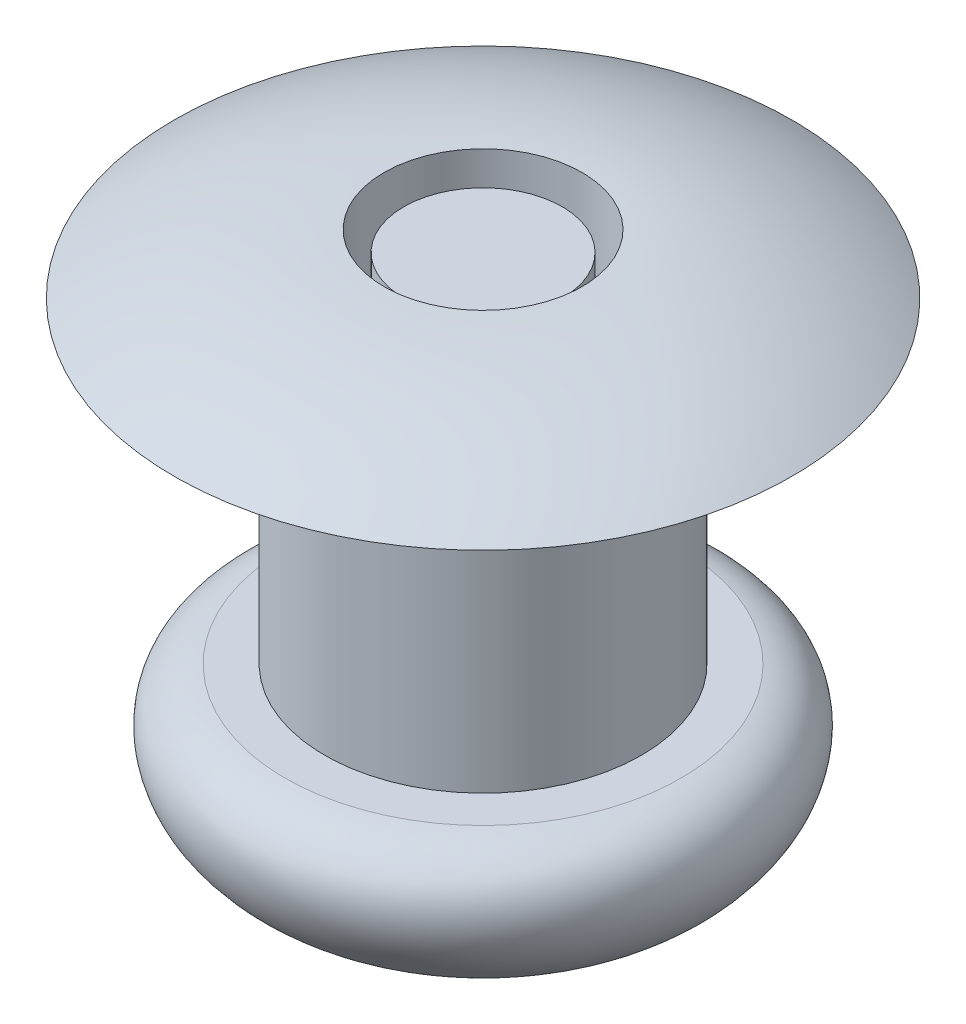
ISO-10303-21;
HEADER;
FILE_DESCRIPTION(('STEP AP214'),'2;1');
FILE_NAME('part.step','',(''),(''),'','','');
FILE_SCHEMA(('AUTOMOTIVE_DESIGN { 1 0 10303 214 1 1 1 1 }'));
ENDSEC;
DATA;
#1=APPLICATION_CONTEXT('core data for automotive mechanical design processes');
#2=APPLICATION_PROTOCOL_DEFINITION('international standard','automotive_design',2000,#1);
#3=PRODUCT_CONTEXT('',#1,'mechanical');
#4=PRODUCT('Part','Part','',(#3));
#5=PRODUCT_RELATED_PRODUCT_CATEGORY('part','',(#4));
#6=PRODUCT_DEFINITION_FORMATION('','',#4);
#7=PRODUCT_DEFINITION_CONTEXT('part definition',#1,'design');
#8=PRODUCT_DEFINITION('design','',#6,#7);
#9=PRODUCT_DEFINITION_SHAPE('','',#8);
#10=(LENGTH_UNIT() NAMED_UNIT(*) SI_UNIT(.MILLI.,.METRE.));
#11=(NAMED_UNIT(*) PLANE_ANGLE_UNIT() SI_UNIT($,.RADIAN.));
#12=(NAMED_UNIT(*) SI_UNIT($,.STERADIAN.) SOLID_ANGLE_UNIT());
#13=UNCERTAINTY_MEASURE_WITH_UNIT(LENGTH_MEASURE(1.E-05),#10,'distance_accuracy_value','');
#14=(GEOMETRIC_REPRESENTATION_CONTEXT(3) GLOBAL_UNCERTAINTY_ASSIGNED_CONTEXT((#13)) GLOBAL_UNIT_ASSIGNED_CONTEXT((#10,
#11,#12)) REPRESENTATION_CONTEXT('',''));
#15=CARTESIAN_POINT('',(0.,0.,0.));
#16=DIRECTION('',(0.,0.,1.));
#17=DIRECTION('',(1.,0.,0.));
#18=AXIS2_PLACEMENT_3D('',#15,#16,#17);
#19=CARTESIAN_POINT('',(0.,-4.30666666666667,0.));
#20=DIRECTION('',(0.,1.,0.));
#21=DIRECTION('',(-1.,0.,0.));
#22=AXIS2_PLACEMENT_3D('',#19,#20,#21);
#23=DEGENERATE_TOROIDAL_SURFACE('',#22,1.25,5.05666666666667,.T.);
#24=CARTESIAN_POINT('',(0.,0.,0.));
#25=DIRECTION('',(0.,1.,0.));
#26=DIRECTION('',(-1.,0.,0.));
#27=AXIS2_PLACEMENT_3D('',#24,#25,#26);
#28=CIRCLE('',#27,3.9);
#29=CARTESIAN_POINT('',(-3.9,0.,0.));
#30=VERTEX_POINT('',#29);
#31=EDGE_CURVE('E11',#30,#30,#28,.T.);
#32=ORIENTED_EDGE('',*,*,#31,.T.);
#33=EDGE_LOOP('',(#32));
#34=FACE_BOUND('',#33,.T.);
#35=CARTESIAN_POINT('',(0.,0.75,0.));
#36=DIRECTION('',(0.,1.,0.));
#37=DIRECTION('',(-1.,0.,0.));
#38=AXIS2_PLACEMENT_3D('',#35,#36,#37);
#39=CIRCLE('',#38,1.25);
#40=CARTESIAN_POINT('',(-1.25,0.75,0.));
#41=VERTEX_POINT('',#40);
#42=EDGE_CURVE('E82',#41,#41,#39,.T.);
#43=ORIENTED_EDGE('',*,*,#42,.F.);
#44=EDGE_LOOP('',(#43));
#45=FACE_BOUND('',#44,.T.);
#46=ADVANCED_FACE('F31',(#34,#45),#23,.T.);
#47=CARTESIAN_POINT('',(-3.9,0.,0.));
#48=DIRECTION('',(0.,-1.,0.));
#49=DIRECTION('',(1.,0.,0.));
#50=AXIS2_PLACEMENT_3D('',#47,#48,#49);
#51=PLANE('',#50);
#52=CARTESIAN_POINT('',(0.,0.,0.));
#53=DIRECTION('',(0.,1.,0.));
#54=DIRECTION('',(-1.,0.,0.));
#55=AXIS2_PLACEMENT_3D('',#52,#53,#54);
#56=CIRCLE('',#55,2.);
#57=CARTESIAN_POINT('',(-2.,0.,0.));
#58=VERTEX_POINT('',#57);
#59=EDGE_CURVE('E37',#58,#58,#56,.T.);
#60=ORIENTED_EDGE('',*,*,#59,.T.);
#61=EDGE_LOOP('',(#60));
#62=FACE_BOUND('',#61,.T.);
#63=ORIENTED_EDGE('',*,*,#31,.F.);
#64=EDGE_LOOP('',(#63));
#65=FACE_BOUND('',#64,.T.);
#66=ADVANCED_FACE('F62',(#62,#65),#51,.T.);
#67=CARTESIAN_POINT('',(0.,0.5,0.));
#68=DIRECTION('',(0.,1.,0.));
#69=DIRECTION('',(-1.,0.,0.));
#70=AXIS2_PLACEMENT_3D('',#67,#68,#69);
#71=CYLINDRICAL_SURFACE('',#70,2.);
#72=CARTESIAN_POINT('',(0.,-4.,0.));
#73=DIRECTION('',(0.,1.,0.));
#74=DIRECTION('',(-1.,0.,0.));
#75=AXIS2_PLACEMENT_3D('',#72,#73,#74);
#76=CIRCLE('',#75,2.);
#77=CARTESIAN_POINT('',(-2.,-4.,0.));
#78=VERTEX_POINT('',#77);
#79=EDGE_CURVE('E50',#78,#78,#76,.T.);
#80=ORIENTED_EDGE('',*,*,#79,.T.);
#81=EDGE_LOOP('',(#80));
#82=FACE_BOUND('',#81,.T.);
#83=ORIENTED_EDGE('',*,*,#59,.F.);
#84=EDGE_LOOP('',(#83));
#85=FACE_BOUND('',#84,.T.);
#86=ADVANCED_FACE('F65',(#82,#85),#71,.T.);
#87=CARTESIAN_POINT('',(-2.,-3.99999999999998,0.));
#88=DIRECTION('',(0.,1.,0.));
#89=DIRECTION('',(-1.,0.,0.));
#90=AXIS2_PLACEMENT_3D('',#87,#88,#89);
#91=PLANE('',#90);
#92=CARTESIAN_POINT('',(0.,-3.99999999999996,0.));
#93=DIRECTION('',(0.,1.,0.));
#94=DIRECTION('',(-1.,0.,0.));
#95=AXIS2_PLACEMENT_3D('',#92,#93,#94);
#96=CIRCLE('',#95,2.5);
#97=CARTESIAN_POINT('',(-2.5,-3.99999999999996,0.));
#98=VERTEX_POINT('',#97);
#99=EDGE_CURVE('E48',#98,#98,#96,.T.);
#100=ORIENTED_EDGE('',*,*,#99,.T.);
#101=EDGE_LOOP('',(#100));
#102=FACE_BOUND('',#101,.T.);
#103=ORIENTED_EDGE('',*,*,#79,.F.);
#104=EDGE_LOOP('',(#103));
#105=FACE_BOUND('',#104,.T.);
#106=ADVANCED_FACE('F44',(#102,#105),#91,.T.);
#107=CARTESIAN_POINT('',(-2.5,-3.99999999999996,0.));
#108=CARTESIAN_POINT('',(-3.32761097394019,-4.14775292745039,0.));
#109=CARTESIAN_POINT('',(-3.25490782709881,-5.96543310118173,0.));
#110=CARTESIAN_POINT('',(-0.030071268354575,-6.37678997472578,0.));
#111=CARTESIAN_POINT('',(-1.22899897091976,-4.32499563135928,0.));
#112=CARTESIAN_POINT('',(-0.216890965209562,-5.49122940777699,0.));
#113=CARTESIAN_POINT('',(0.,-5.42152304510539,0.));
#114=B_SPLINE_CURVE_WITH_KNOTS('',3,(#107,#108,#109,#110,#111,#112,#113),.UNSPECIFIED.,.F.,.F.,
(4,1,1,1,4),(0.,0.343812161723674,0.687238793665517,0.819798770245989,1.),.UNSPECIFIED.);
#115=CARTESIAN_POINT('',(0.,0.5,0.));
#116=DIRECTION('',(0.,1.,0.));
#117=AXIS1_PLACEMENT('',#115,#116);
#118=SURFACE_OF_REVOLUTION('',#114,#117);
#119=CARTESIAN_POINT('',(0.,-5.42152304510543,0.));
#120=VERTEX_POINT('',#119);
#121=VERTEX_LOOP('',#120);
#122=FACE_BOUND('',#121,.T.);
#123=ORIENTED_EDGE('',*,*,#99,.F.);
#124=EDGE_LOOP('',(#123));
#125=FACE_BOUND('',#124,.T.);
#126=ADVANCED_FACE('F40',(#122,#125),#118,.F.);
#127=CARTESIAN_POINT('',(-1.,0.5,0.));
#128=DIRECTION('',(0.,1.,0.));
#129=DIRECTION('',(-1.,0.,0.));
#130=AXIS2_PLACEMENT_3D('',#127,#128,#129);
#131=PLANE('',#130);
#132=CARTESIAN_POINT('',(0.,0.5,0.));
#133=DIRECTION('',(0.,1.,0.));
#134=DIRECTION('',(-1.,0.,0.));
#135=AXIS2_PLACEMENT_3D('',#132,#133,#134);
#136=CIRCLE('',#135,1.);
#137=CARTESIAN_POINT('',(-1.,0.5,0.));
#138=VERTEX_POINT('',#137);
#139=EDGE_CURVE('E51',#138,#138,#136,.T.);
#140=ORIENTED_EDGE('',*,*,#139,.T.);
#141=EDGE_LOOP('',(#140));
#142=FACE_BOUND('',#141,.T.);
#143=ADVANCED_FACE('F43',(#142),#131,.T.);
#144=CARTESIAN_POINT('',(0.,0.5,0.));
#145=DIRECTION('',(0.,1.,0.));
#146=DIRECTION('',(-1.,0.,0.));
#147=AXIS2_PLACEMENT_3D('',#144,#145,#146);
#148=CYLINDRICAL_SURFACE('',#147,1.);
#149=CARTESIAN_POINT('',(0.,-4.,0.));
#150=DIRECTION('',(0.,1.,0.));
#151=DIRECTION('',(-1.,0.,0.));
#152=AXIS2_PLACEMENT_3D('',#149,#150,#151);
#153=CIRCLE('',#152,1.);
#154=CARTESIAN_POINT('',(-1.,-4.,0.));
#155=VERTEX_POINT('',#154);
#156=EDGE_CURVE('E56',#155,#155,#153,.T.);
#157=ORIENTED_EDGE('',*,*,#156,.T.);
#158=EDGE_LOOP('',(#157));
#159=FACE_BOUND('',#158,.T.);
#160=ORIENTED_EDGE('',*,*,#139,.F.);
#161=EDGE_LOOP('',(#160));
#162=FACE_BOUND('',#161,.T.);
#163=ADVANCED_FACE('F95',(#159,#162),#148,.T.);
#164=CARTESIAN_POINT('',(-1.25,-4.,0.));
#165=DIRECTION('',(0.,1.,0.));
#166=DIRECTION('',(-1.,0.,0.));
#167=AXIS2_PLACEMENT_3D('',#164,#165,#166);
#168=PLANE('',#167);
#169=CARTESIAN_POINT('',(0.,-4.,0.));
#170=DIRECTION('',(0.,1.,0.));
#171=DIRECTION('',(-1.,0.,0.));
#172=AXIS2_PLACEMENT_3D('',#169,#170,#171);
#173=CIRCLE('',#172,1.25);
#174=CARTESIAN_POINT('',(-1.25,-4.,0.));
#175=VERTEX_POINT('',#174);
#176=EDGE_CURVE('E84',#175,#175,#173,.T.);
#177=ORIENTED_EDGE('',*,*,#176,.T.);
#178=EDGE_LOOP('',(#177));
#179=FACE_BOUND('',#178,.T.);
#180=ORIENTED_EDGE('',*,*,#156,.F.);
#181=EDGE_LOOP('',(#180));
#182=FACE_BOUND('',#181,.T.);
#183=ADVANCED_FACE('F98',(#179,#182),#168,.T.);
#184=CARTESIAN_POINT('',(0.,0.5,0.));
#185=DIRECTION('',(0.,1.,0.));
#186=DIRECTION('',(-1.,0.,0.));
#187=AXIS2_PLACEMENT_3D('',#184,#185,#186);
#188=CYLINDRICAL_SURFACE('',#187,1.25);
#189=ORIENTED_EDGE('',*,*,#42,.T.);
#190=EDGE_LOOP('',(#189));
#191=FACE_BOUND('',#190,.T.);
#192=ORIENTED_EDGE('',*,*,#176,.F.);
#193=EDGE_LOOP('',(#192));
#194=FACE_BOUND('',#193,.T.);
#195=ADVANCED_FACE('F100',(#191,#194),#188,.F.);
#196=CLOSED_SHELL('',(#46,#66,#86,#106,#126,#143,#163,#183,#195));
#197=MANIFOLD_SOLID_BREP('B2',#196);
#198=ADVANCED_BREP_SHAPE_REPRESENTATION('',(#18,#197),#14);
#199=SHAPE_DEFINITION_REPRESENTATION(#9,#198);
ENDSEC;
END-ISO-10303-21;
